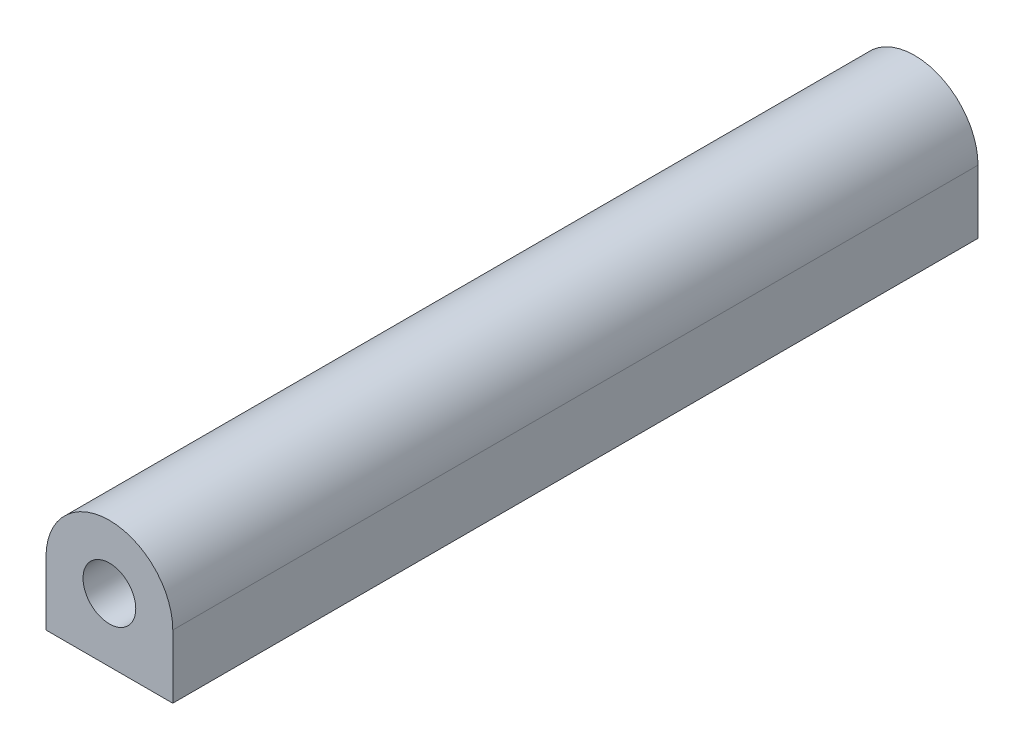
ISO-10303-21;
HEADER;
FILE_DESCRIPTION(('STEP AP214'),'2;1');
FILE_NAME('part.step','',(''),(''),'','','');
FILE_SCHEMA(('AUTOMOTIVE_DESIGN { 1 0 10303 214 1 1 1 1 }'));
ENDSEC;
DATA;
#1=APPLICATION_CONTEXT('core data for automotive mechanical design processes');
#2=APPLICATION_PROTOCOL_DEFINITION('international standard','automotive_design',2000,#1);
#3=PRODUCT_CONTEXT('',#1,'mechanical');
#4=PRODUCT('Part','Part','',(#3));
#5=PRODUCT_RELATED_PRODUCT_CATEGORY('part','',(#4));
#6=PRODUCT_DEFINITION_FORMATION('','',#4);
#7=PRODUCT_DEFINITION_CONTEXT('part definition',#1,'design');
#8=PRODUCT_DEFINITION('design','',#6,#7);
#9=PRODUCT_DEFINITION_SHAPE('','',#8);
#10=(LENGTH_UNIT() NAMED_UNIT(*) SI_UNIT(.MILLI.,.METRE.));
#11=(NAMED_UNIT(*) PLANE_ANGLE_UNIT() SI_UNIT($,.RADIAN.));
#12=(NAMED_UNIT(*) SI_UNIT($,.STERADIAN.) SOLID_ANGLE_UNIT());
#13=UNCERTAINTY_MEASURE_WITH_UNIT(LENGTH_MEASURE(1.E-05),#10,'distance_accuracy_value','');
#14=(GEOMETRIC_REPRESENTATION_CONTEXT(3) GLOBAL_UNCERTAINTY_ASSIGNED_CONTEXT((#13)) GLOBAL_UNIT_ASSIGNED_CONTEXT((#10,
#11,#12)) REPRESENTATION_CONTEXT('',''));
#15=CARTESIAN_POINT('',(0.,0.,0.));
#16=DIRECTION('',(0.,0.,1.));
#17=DIRECTION('',(1.,0.,0.));
#18=AXIS2_PLACEMENT_3D('',#15,#16,#17);
#19=CARTESIAN_POINT('',(0.,0.,43.5096));
#20=DIRECTION('',(0.,0.,-1.));
#21=DIRECTION('',(-1.,0.,0.));
#22=AXIS2_PLACEMENT_3D('',#19,#20,#21);
#23=CYLINDRICAL_SURFACE('',#22,3.425);
#24=CARTESIAN_POINT('',(0.,0.,43.5096));
#25=DIRECTION('',(0.,0.,1.));
#26=DIRECTION('',(1.,0.,0.));
#27=AXIS2_PLACEMENT_3D('',#24,#25,#26);
#28=CIRCLE('',#27,3.425);
#29=CARTESIAN_POINT('',(3.425,0.,43.5096));
#30=VERTEX_POINT('',#29);
#31=CARTESIAN_POINT('',(-3.425,0.,43.5096));
#32=VERTEX_POINT('',#31);
#33=EDGE_CURVE('E12',#30,#32,#28,.T.);
#34=ORIENTED_EDGE('',*,*,#33,.F.);
#35=DIRECTION('',(0.,0.,1.));
#36=VECTOR('',#35,1.);
#37=CARTESIAN_POINT('',(3.425,0.,-4.84368145112785));
#38=LINE('',#37,#36);
#39=CARTESIAN_POINT('',(3.425,0.,0.));
#40=VERTEX_POINT('',#39);
#41=EDGE_CURVE('E111',#40,#30,#38,.T.);
#42=ORIENTED_EDGE('',*,*,#41,.F.);
#43=CARTESIAN_POINT('',(0.,0.,0.));
#44=DIRECTION('',(0.,0.,1.));
#45=DIRECTION('',(1.,0.,0.));
#46=AXIS2_PLACEMENT_3D('',#43,#44,#45);
#47=CIRCLE('',#46,3.425);
#48=CARTESIAN_POINT('',(-3.425,0.,0.));
#49=VERTEX_POINT('',#48);
#50=EDGE_CURVE('E70',#40,#49,#47,.T.);
#51=ORIENTED_EDGE('',*,*,#50,.T.);
#52=DIRECTION('',(0.,0.,1.));
#53=VECTOR('',#52,1.);
#54=CARTESIAN_POINT('',(-3.425,0.,-4.84368145112785));
#55=LINE('',#54,#53);
#56=EDGE_CURVE('E154',#49,#32,#55,.T.);
#57=ORIENTED_EDGE('',*,*,#56,.T.);
#58=EDGE_LOOP('',(#34,#42,#51,#57));
#59=FACE_BOUND('',#58,.T.);
#60=ADVANCED_FACE('F67',(#59),#23,.T.);
#61=CARTESIAN_POINT('',(0.,0.,43.5096));
#62=DIRECTION('',(0.,0.,1.));
#63=DIRECTION('',(1.,0.,0.));
#64=AXIS2_PLACEMENT_3D('',#61,#62,#63);
#65=PLANE('',#64);
#66=CARTESIAN_POINT('',(0.,0.,43.5096));
#67=DIRECTION('',(0.,0.,1.));
#68=DIRECTION('',(1.,0.,0.));
#69=AXIS2_PLACEMENT_3D('',#66,#67,#68);
#70=CIRCLE('',#69,1.425);
#71=CARTESIAN_POINT('',(1.425,0.,43.5096));
#72=VERTEX_POINT('',#71);
#73=EDGE_CURVE('E142',#72,#72,#70,.T.);
#74=ORIENTED_EDGE('',*,*,#73,.F.);
#75=EDGE_LOOP('',(#74));
#76=FACE_BOUND('',#75,.T.);
#77=DIRECTION('',(1.,0.,0.));
#78=VECTOR('',#77,1.);
#79=CARTESIAN_POINT('',(0.,-3.425,43.5096));
#80=LINE('',#79,#78);
#81=CARTESIAN_POINT('',(-3.425,-3.425,43.5096));
#82=VERTEX_POINT('',#81);
#83=CARTESIAN_POINT('',(3.425,-3.425,43.5096));
#84=VERTEX_POINT('',#83);
#85=EDGE_CURVE('E155',#82,#84,#80,.T.);
#86=ORIENTED_EDGE('',*,*,#85,.T.);
#87=DIRECTION('',(0.,-1.,0.));
#88=VECTOR('',#87,1.);
#89=CARTESIAN_POINT('',(3.425,0.,43.5096));
#90=LINE('',#89,#88);
#91=EDGE_CURVE('E118',#30,#84,#90,.T.);
#92=ORIENTED_EDGE('',*,*,#91,.F.);
#93=ORIENTED_EDGE('',*,*,#33,.T.);
#94=DIRECTION('',(0.,-1.,0.));
#95=VECTOR('',#94,1.);
#96=CARTESIAN_POINT('',(-3.425,0.,43.5096));
#97=LINE('',#96,#95);
#98=EDGE_CURVE('E160',#32,#82,#97,.T.);
#99=ORIENTED_EDGE('',*,*,#98,.T.);
#100=EDGE_LOOP('',(#86,#92,#93,#99));
#101=FACE_BOUND('',#100,.T.);
#102=ADVANCED_FACE('F171',(#76,#101),#65,.T.);
#103=CARTESIAN_POINT('',(0.,0.,0.));
#104=DIRECTION('',(0.,0.,1.));
#105=DIRECTION('',(1.,0.,0.));
#106=AXIS2_PLACEMENT_3D('',#103,#104,#105);
#107=PLANE('',#106);
#108=CARTESIAN_POINT('',(0.,0.,0.));
#109=DIRECTION('',(0.,0.,-1.));
#110=DIRECTION('',(-1.,0.,0.));
#111=AXIS2_PLACEMENT_3D('',#108,#109,#110);
#112=CIRCLE('',#111,1.475);
#113=CARTESIAN_POINT('',(-1.475,0.,0.));
#114=VERTEX_POINT('',#113);
#115=EDGE_CURVE('E130',#114,#114,#112,.T.);
#116=ORIENTED_EDGE('',*,*,#115,.F.);
#117=EDGE_LOOP('',(#116));
#118=FACE_BOUND('',#117,.T.);
#119=ORIENTED_EDGE('',*,*,#50,.F.);
#120=DIRECTION('',(0.,1.,0.));
#121=VECTOR('',#120,1.);
#122=CARTESIAN_POINT('',(3.425,0.,0.));
#123=LINE('',#122,#121);
#124=CARTESIAN_POINT('',(3.425,-3.425,0.));
#125=VERTEX_POINT('',#124);
#126=EDGE_CURVE('E108',#125,#40,#123,.T.);
#127=ORIENTED_EDGE('',*,*,#126,.F.);
#128=DIRECTION('',(-1.,0.,0.));
#129=VECTOR('',#128,1.);
#130=CARTESIAN_POINT('',(0.,-3.425,0.));
#131=LINE('',#130,#129);
#132=CARTESIAN_POINT('',(-3.425,-3.425,0.));
#133=VERTEX_POINT('',#132);
#134=EDGE_CURVE('E145',#125,#133,#131,.T.);
#135=ORIENTED_EDGE('',*,*,#134,.T.);
#136=DIRECTION('',(0.,1.,0.));
#137=VECTOR('',#136,1.);
#138=CARTESIAN_POINT('',(-3.425,0.,0.));
#139=LINE('',#138,#137);
#140=EDGE_CURVE('E122',#133,#49,#139,.T.);
#141=ORIENTED_EDGE('',*,*,#140,.T.);
#142=EDGE_LOOP('',(#119,#127,#135,#141));
#143=FACE_BOUND('',#142,.T.);
#144=ADVANCED_FACE('F120',(#118,#143),#107,.F.);
#145=CARTESIAN_POINT('',(0.,0.,10.));
#146=DIRECTION('',(0.,0.,-1.));
#147=DIRECTION('',(-1.,0.,0.));
#148=AXIS2_PLACEMENT_3D('',#145,#146,#147);
#149=CYLINDRICAL_SURFACE('',#148,1.475);
#150=CARTESIAN_POINT('',(0.,0.,10.));
#151=DIRECTION('',(0.,0.,-1.));
#152=DIRECTION('',(-1.,0.,0.));
#153=AXIS2_PLACEMENT_3D('',#150,#151,#152);
#154=CIRCLE('',#153,1.475);
#155=CARTESIAN_POINT('',(-1.475,0.,10.));
#156=VERTEX_POINT('',#155);
#157=EDGE_CURVE('E125',#156,#156,#154,.T.);
#158=ORIENTED_EDGE('',*,*,#157,.F.);
#159=EDGE_LOOP('',(#158));
#160=FACE_BOUND('',#159,.T.);
#161=ORIENTED_EDGE('',*,*,#115,.T.);
#162=EDGE_LOOP('',(#161));
#163=FACE_BOUND('',#162,.T.);
#164=ADVANCED_FACE('F195',(#160,#163),#149,.F.);
#165=CARTESIAN_POINT('',(0.,0.,10.));
#166=DIRECTION('',(0.,0.,-1.));
#167=DIRECTION('',(-1.,0.,0.));
#168=AXIS2_PLACEMENT_3D('',#165,#166,#167);
#169=PLANE('',#168);
#170=ORIENTED_EDGE('',*,*,#157,.T.);
#171=EDGE_LOOP('',(#170));
#172=FACE_BOUND('',#171,.T.);
#173=ADVANCED_FACE('F201',(#172),#169,.T.);
#174=CARTESIAN_POINT('',(0.,0.,33.5096));
#175=DIRECTION('',(0.,0.,1.));
#176=DIRECTION('',(1.,0.,0.));
#177=AXIS2_PLACEMENT_3D('',#174,#175,#176);
#178=CYLINDRICAL_SURFACE('',#177,1.425);
#179=CARTESIAN_POINT('',(0.,0.,33.5096));
#180=DIRECTION('',(0.,0.,1.));
#181=DIRECTION('',(1.,0.,0.));
#182=AXIS2_PLACEMENT_3D('',#179,#180,#181);
#183=CIRCLE('',#182,1.425);
#184=CARTESIAN_POINT('',(1.425,0.,33.5096));
#185=VERTEX_POINT('',#184);
#186=EDGE_CURVE('E139',#185,#185,#183,.T.);
#187=ORIENTED_EDGE('',*,*,#186,.F.);
#188=EDGE_LOOP('',(#187));
#189=FACE_BOUND('',#188,.T.);
#190=ORIENTED_EDGE('',*,*,#73,.T.);
#191=EDGE_LOOP('',(#190));
#192=FACE_BOUND('',#191,.T.);
#193=ADVANCED_FACE('F183',(#189,#192),#178,.F.);
#194=CARTESIAN_POINT('',(0.,0.,33.5096));
#195=DIRECTION('',(0.,0.,1.));
#196=DIRECTION('',(1.,0.,0.));
#197=AXIS2_PLACEMENT_3D('',#194,#195,#196);
#198=PLANE('',#197);
#199=ORIENTED_EDGE('',*,*,#186,.T.);
#200=EDGE_LOOP('',(#199));
#201=FACE_BOUND('',#200,.T.);
#202=ADVANCED_FACE('F176',(#201),#198,.T.);
#203=CARTESIAN_POINT('',(-3.425,0.,-4.84368145112785));
#204=DIRECTION('',(-1.,0.,0.));
#205=DIRECTION('',(0.,0.,1.));
#206=AXIS2_PLACEMENT_3D('',#203,#204,#205);
#207=PLANE('',#206);
#208=ORIENTED_EDGE('',*,*,#140,.F.);
#209=DIRECTION('',(0.,0.,1.));
#210=VECTOR('',#209,1.);
#211=CARTESIAN_POINT('',(-3.425,-3.425,-4.84368145112785));
#212=LINE('',#211,#210);
#213=EDGE_CURVE('E151',#133,#82,#212,.T.);
#214=ORIENTED_EDGE('',*,*,#213,.T.);
#215=ORIENTED_EDGE('',*,*,#98,.F.);
#216=ORIENTED_EDGE('',*,*,#56,.F.);
#217=EDGE_LOOP('',(#208,#214,#215,#216));
#218=FACE_BOUND('',#217,.T.);
#219=ADVANCED_FACE('F174',(#218),#207,.T.);
#220=CARTESIAN_POINT('',(0.,-3.425,-4.84368145112785));
#221=DIRECTION('',(0.,-1.,0.));
#222=DIRECTION('',(0.,0.,-1.));
#223=AXIS2_PLACEMENT_3D('',#220,#221,#222);
#224=PLANE('',#223);
#225=ORIENTED_EDGE('',*,*,#134,.F.);
#226=DIRECTION('',(0.,0.,1.));
#227=VECTOR('',#226,1.);
#228=CARTESIAN_POINT('',(3.425,-3.425,-4.84368145112785));
#229=LINE('',#228,#227);
#230=EDGE_CURVE('E113',#125,#84,#229,.T.);
#231=ORIENTED_EDGE('',*,*,#230,.T.);
#232=ORIENTED_EDGE('',*,*,#85,.F.);
#233=ORIENTED_EDGE('',*,*,#213,.F.);
#234=EDGE_LOOP('',(#225,#231,#232,#233));
#235=FACE_BOUND('',#234,.T.);
#236=ADVANCED_FACE('F169',(#235),#224,.T.);
#237=CARTESIAN_POINT('',(3.425,0.,-4.84368145112785));
#238=DIRECTION('',(-1.,0.,0.));
#239=DIRECTION('',(0.,0.,1.));
#240=AXIS2_PLACEMENT_3D('',#237,#238,#239);
#241=PLANE('',#240);
#242=ORIENTED_EDGE('',*,*,#230,.F.);
#243=ORIENTED_EDGE('',*,*,#126,.T.);
#244=ORIENTED_EDGE('',*,*,#41,.T.);
#245=ORIENTED_EDGE('',*,*,#91,.T.);
#246=EDGE_LOOP('',(#242,#243,#244,#245));
#247=FACE_BOUND('',#246,.T.);
#248=ADVANCED_FACE('F109',(#247),#241,.F.);
#249=CLOSED_SHELL('',(#60,#102,#144,#164,#173,#193,#202,#219,#236,#248));
#250=MANIFOLD_SOLID_BREP('B2',#249);
#251=ADVANCED_BREP_SHAPE_REPRESENTATION('',(#18,#250),#14);
#252=SHAPE_DEFINITION_REPRESENTATION(#9,#251);
ENDSEC;
END-ISO-10303-21;
